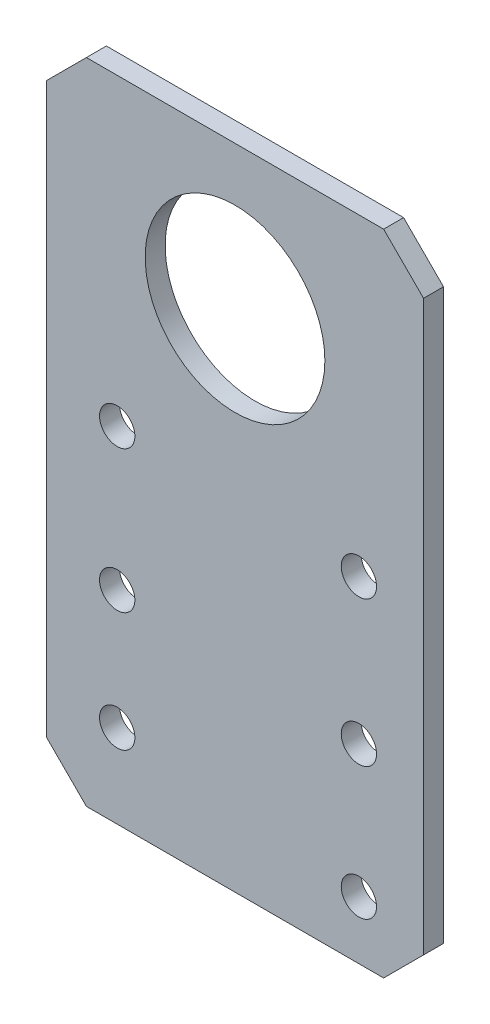
ISO-10303-21;
HEADER;
FILE_DESCRIPTION(('STEP AP214'),'2;1');
FILE_NAME('part.step','',(''),(''),'','','');
FILE_SCHEMA(('AUTOMOTIVE_DESIGN { 1 0 10303 214 1 1 1 1 }'));
ENDSEC;
DATA;
#1=APPLICATION_CONTEXT('core data for automotive mechanical design processes');
#2=APPLICATION_PROTOCOL_DEFINITION('international standard','automotive_design',2000,#1);
#3=PRODUCT_CONTEXT('',#1,'mechanical');
#4=PRODUCT('Part','Part','',(#3));
#5=PRODUCT_RELATED_PRODUCT_CATEGORY('part','',(#4));
#6=PRODUCT_DEFINITION_FORMATION('','',#4);
#7=PRODUCT_DEFINITION_CONTEXT('part definition',#1,'design');
#8=PRODUCT_DEFINITION('design','',#6,#7);
#9=PRODUCT_DEFINITION_SHAPE('','',#8);
#10=(LENGTH_UNIT() NAMED_UNIT(*) SI_UNIT(.MILLI.,.METRE.));
#11=(NAMED_UNIT(*) PLANE_ANGLE_UNIT() SI_UNIT($,.RADIAN.));
#12=(NAMED_UNIT(*) SI_UNIT($,.STERADIAN.) SOLID_ANGLE_UNIT());
#13=UNCERTAINTY_MEASURE_WITH_UNIT(LENGTH_MEASURE(1.E-05),#10,'distance_accuracy_value','');
#14=(GEOMETRIC_REPRESENTATION_CONTEXT(3) GLOBAL_UNCERTAINTY_ASSIGNED_CONTEXT((#13)) GLOBAL_UNIT_ASSIGNED_CONTEXT((#10,
#11,#12)) REPRESENTATION_CONTEXT('',''));
#15=CARTESIAN_POINT('',(0.,0.,0.));
#16=DIRECTION('',(0.,0.,1.));
#17=DIRECTION('',(1.,0.,0.));
#18=AXIS2_PLACEMENT_3D('',#15,#16,#17);
#19=CARTESIAN_POINT('',(0.,0.,3.175));
#20=DIRECTION('',(0.,0.,1.));
#21=DIRECTION('',(1.,0.,0.));
#22=AXIS2_PLACEMENT_3D('',#19,#20,#21);
#23=PLANE('',#22);
#24=CARTESIAN_POINT('',(275.136823716082,60.793377216612,3.175));
#25=DIRECTION('',(0.,0.,1.));
#26=DIRECTION('',(1.,0.,0.));
#27=AXIS2_PLACEMENT_3D('',#24,#25,#26);
#28=CIRCLE('',#27,2.8067);
#29=CARTESIAN_POINT('',(277.943523716082,60.793377216612,3.175));
#30=VERTEX_POINT('',#29);
#31=EDGE_CURVE('E202',#30,#30,#28,.F.);
#32=ORIENTED_EDGE('',*,*,#31,.T.);
#33=EDGE_LOOP('',(#32));
#34=FACE_BOUND('',#33,.T.);
#35=CARTESIAN_POINT('',(313.565840920205,58.8263999407559,3.175));
#36=DIRECTION('',(0.,0.,1.));
#37=DIRECTION('',(1.,0.,0.));
#38=AXIS2_PLACEMENT_3D('',#35,#36,#37);
#39=CIRCLE('',#38,2.8067);
#40=CARTESIAN_POINT('',(316.372540920205,58.8263999407559,3.175));
#41=VERTEX_POINT('',#40);
#42=EDGE_CURVE('E196',#41,#41,#39,.F.);
#43=ORIENTED_EDGE('',*,*,#42,.T.);
#44=EDGE_LOOP('',(#43));
#45=FACE_BOUND('',#44,.T.);
#46=CARTESIAN_POINT('',(313.565840920205,81.8855543431027,3.175));
#47=DIRECTION('',(0.,0.,1.));
#48=DIRECTION('',(1.,0.,0.));
#49=AXIS2_PLACEMENT_3D('',#46,#47,#48);
#50=CIRCLE('',#49,2.8067);
#51=CARTESIAN_POINT('',(316.372540920205,81.8855543431027,3.175));
#52=VERTEX_POINT('',#51);
#53=EDGE_CURVE('E190',#52,#52,#50,.F.);
#54=ORIENTED_EDGE('',*,*,#53,.T.);
#55=EDGE_LOOP('',(#54));
#56=FACE_BOUND('',#55,.T.);
#57=CARTESIAN_POINT('',(275.136823716082,41.8476468841504,3.175));
#58=DIRECTION('',(0.,0.,1.));
#59=DIRECTION('',(1.,0.,0.));
#60=AXIS2_PLACEMENT_3D('',#57,#58,#59);
#61=CIRCLE('',#60,2.8067);
#62=CARTESIAN_POINT('',(277.943523716082,41.8476468841504,3.175));
#63=VERTEX_POINT('',#62);
#64=EDGE_CURVE('E184',#63,#63,#61,.F.);
#65=ORIENTED_EDGE('',*,*,#64,.T.);
#66=EDGE_LOOP('',(#65));
#67=FACE_BOUND('',#66,.T.);
#68=DIRECTION('',(0.,-1.,0.));
#69=VECTOR('',#68,1.);
#70=CARTESIAN_POINT('',(263.889187586837,0.,3.175));
#71=LINE('',#70,#69);
#72=CARTESIAN_POINT('',(263.889187586837,125.321220391347,3.175));
#73=VERTEX_POINT('',#72);
#74=CARTESIAN_POINT('',(263.889187586837,34.8981609212184,3.175));
#75=VERTEX_POINT('',#74);
#76=EDGE_CURVE('E173',#73,#75,#71,.T.);
#77=ORIENTED_EDGE('',*,*,#76,.T.);
#78=DIRECTION('',(-0.707106781186548,0.707106781186547,0.));
#79=VECTOR('',#78,1.);
#80=CARTESIAN_POINT('',(149.393674254028,149.393674254028,3.175));
#81=LINE('',#80,#79);
#82=CARTESIAN_POINT('',(270.239187586837,28.5481609212184,3.175));
#83=VERTEX_POINT('',#82);
#84=EDGE_CURVE('E150',#75,#83,#81,.F.);
#85=ORIENTED_EDGE('',*,*,#84,.T.);
#86=DIRECTION('',(1.,0.,0.));
#87=VECTOR('',#86,1.);
#88=CARTESIAN_POINT('',(0.,28.5481609212184,3.175));
#89=LINE('',#88,#87);
#90=CARTESIAN_POINT('',(317.5,28.5481609212184,3.175));
#91=VERTEX_POINT('',#90);
#92=EDGE_CURVE('E120',#83,#91,#89,.T.);
#93=ORIENTED_EDGE('',*,*,#92,.T.);
#94=DIRECTION('',(0.70710678118655,0.707106781186545,0.));
#95=VECTOR('',#94,1.);
#96=CARTESIAN_POINT('',(144.47591953939,-144.475919539391,3.175));
#97=LINE('',#96,#95);
#98=CARTESIAN_POINT('',(323.85,34.8981609212184,3.175));
#99=VERTEX_POINT('',#98);
#100=EDGE_CURVE('E148',#91,#99,#97,.T.);
#101=ORIENTED_EDGE('',*,*,#100,.T.);
#102=DIRECTION('',(0.,-1.,0.));
#103=VECTOR('',#102,1.);
#104=CARTESIAN_POINT('',(323.85,0.,3.175));
#105=LINE('',#104,#103);
#106=CARTESIAN_POINT('',(323.85,125.321220391347,3.175));
#107=VERTEX_POINT('',#106);
#108=EDGE_CURVE('E131',#107,#99,#105,.T.);
#109=ORIENTED_EDGE('',*,*,#108,.F.);
#110=DIRECTION('',(0.707106781186549,-0.707106781186546,0.));
#111=VECTOR('',#110,1.);
#112=CARTESIAN_POINT('',(224.585610195673,224.585610195674,3.175));
#113=LINE('',#112,#111);
#114=CARTESIAN_POINT('',(317.5,131.671220391347,3.175));
#115=VERTEX_POINT('',#114);
#116=EDGE_CURVE('E49',#107,#115,#113,.F.);
#117=ORIENTED_EDGE('',*,*,#116,.T.);
#118=DIRECTION('',(1.,0.,0.));
#119=VECTOR('',#118,1.);
#120=CARTESIAN_POINT('',(0.,131.671220391347,3.175));
#121=LINE('',#120,#119);
#122=CARTESIAN_POINT('',(270.239187586837,131.671220391347,3.175));
#123=VERTEX_POINT('',#122);
#124=EDGE_CURVE('E176',#123,#115,#121,.T.);
#125=ORIENTED_EDGE('',*,*,#124,.F.);
#126=DIRECTION('',(-0.707106781186551,-0.707106781186544,0.));
#127=VECTOR('',#126,1.);
#128=CARTESIAN_POINT('',(69.283983597744,-69.2839835977447,3.175));
#129=LINE('',#128,#127);
#130=EDGE_CURVE('E145',#123,#73,#129,.T.);
#131=ORIENTED_EDGE('',*,*,#130,.T.);
#132=EDGE_LOOP('',(#77,#85,#93,#101,#109,#117,#125,#131));
#133=FACE_BOUND('',#132,.T.);
#134=CARTESIAN_POINT('',(293.869593793419,108.878190342355,3.175));
#135=DIRECTION('',(0.,0.,1.));
#136=DIRECTION('',(1.,0.,0.));
#137=AXIS2_PLACEMENT_3D('',#134,#135,#136);
#138=CIRCLE('',#137,14.2875);
#139=CARTESIAN_POINT('',(308.157093793419,108.878190342355,3.175));
#140=VERTEX_POINT('',#139);
#141=EDGE_CURVE('E127',#140,#140,#138,.T.);
#142=ORIENTED_EDGE('',*,*,#141,.F.);
#143=EDGE_LOOP('',(#142));
#144=FACE_BOUND('',#143,.T.);
#145=CARTESIAN_POINT('',(313.565840920205,37.7866756404615,3.175));
#146=DIRECTION('',(0.,0.,1.));
#147=DIRECTION('',(1.,0.,0.));
#148=AXIS2_PLACEMENT_3D('',#145,#146,#147);
#149=CIRCLE('',#148,2.8067);
#150=CARTESIAN_POINT('',(316.372540920205,37.7866756404615,3.175));
#151=VERTEX_POINT('',#150);
#152=EDGE_CURVE('E169',#151,#151,#149,.F.);
#153=ORIENTED_EDGE('',*,*,#152,.T.);
#154=EDGE_LOOP('',(#153));
#155=FACE_BOUND('',#154,.T.);
#156=CARTESIAN_POINT('',(275.136823716082,83.3634022478691,3.175));
#157=DIRECTION('',(0.,0.,1.));
#158=DIRECTION('',(1.,0.,0.));
#159=AXIS2_PLACEMENT_3D('',#156,#157,#158);
#160=CIRCLE('',#159,2.8067);
#161=CARTESIAN_POINT('',(277.943523716082,83.3634022478691,3.175));
#162=VERTEX_POINT('',#161);
#163=EDGE_CURVE('E208',#162,#162,#160,.F.);
#164=ORIENTED_EDGE('',*,*,#163,.T.);
#165=EDGE_LOOP('',(#164));
#166=FACE_BOUND('',#165,.T.);
#167=ADVANCED_FACE('F34',(#34,#45,#56,#67,#133,#144,#155,#166),#23,.T.);
#168=CARTESIAN_POINT('',(0.,0.,0.));
#169=DIRECTION('',(0.,0.,1.));
#170=DIRECTION('',(1.,0.,0.));
#171=AXIS2_PLACEMENT_3D('',#168,#169,#170);
#172=PLANE('',#171);
#173=CARTESIAN_POINT('',(275.136823716082,83.3634022478691,0.));
#174=DIRECTION('',(0.,0.,-1.));
#175=DIRECTION('',(-1.,0.,0.));
#176=AXIS2_PLACEMENT_3D('',#173,#174,#175);
#177=CIRCLE('',#176,2.8067);
#178=CARTESIAN_POINT('',(272.330123716082,83.3634022478691,0.));
#179=VERTEX_POINT('',#178);
#180=EDGE_CURVE('E211',#179,#179,#177,.T.);
#181=ORIENTED_EDGE('',*,*,#180,.F.);
#182=EDGE_LOOP('',(#181));
#183=FACE_BOUND('',#182,.T.);
#184=CARTESIAN_POINT('',(275.136823716082,60.793377216612,0.));
#185=DIRECTION('',(0.,0.,-1.));
#186=DIRECTION('',(-1.,0.,0.));
#187=AXIS2_PLACEMENT_3D('',#184,#185,#186);
#188=CIRCLE('',#187,2.8067);
#189=CARTESIAN_POINT('',(272.330123716082,60.793377216612,0.));
#190=VERTEX_POINT('',#189);
#191=EDGE_CURVE('E205',#190,#190,#188,.T.);
#192=ORIENTED_EDGE('',*,*,#191,.F.);
#193=EDGE_LOOP('',(#192));
#194=FACE_BOUND('',#193,.T.);
#195=CARTESIAN_POINT('',(313.565840920205,58.8263999407559,0.));
#196=DIRECTION('',(0.,0.,-1.));
#197=DIRECTION('',(-1.,0.,0.));
#198=AXIS2_PLACEMENT_3D('',#195,#196,#197);
#199=CIRCLE('',#198,2.8067);
#200=CARTESIAN_POINT('',(310.759140920205,58.8263999407559,0.));
#201=VERTEX_POINT('',#200);
#202=EDGE_CURVE('E199',#201,#201,#199,.T.);
#203=ORIENTED_EDGE('',*,*,#202,.F.);
#204=EDGE_LOOP('',(#203));
#205=FACE_BOUND('',#204,.T.);
#206=CARTESIAN_POINT('',(293.869593793419,108.878190342355,0.));
#207=DIRECTION('',(0.,0.,1.));
#208=DIRECTION('',(1.,0.,0.));
#209=AXIS2_PLACEMENT_3D('',#206,#207,#208);
#210=CIRCLE('',#209,14.2875);
#211=CARTESIAN_POINT('',(308.157093793419,108.878190342355,0.));
#212=VERTEX_POINT('',#211);
#213=EDGE_CURVE('E166',#212,#212,#210,.T.);
#214=ORIENTED_EDGE('',*,*,#213,.T.);
#215=EDGE_LOOP('',(#214));
#216=FACE_BOUND('',#215,.T.);
#217=DIRECTION('',(1.,0.,0.));
#218=VECTOR('',#217,1.);
#219=CARTESIAN_POINT('',(0.,28.5481609212184,0.));
#220=LINE('',#219,#218);
#221=CARTESIAN_POINT('',(270.239187586837,28.5481609212184,0.));
#222=VERTEX_POINT('',#221);
#223=CARTESIAN_POINT('',(317.5,28.5481609212184,0.));
#224=VERTEX_POINT('',#223);
#225=EDGE_CURVE('E117',#222,#224,#220,.T.);
#226=ORIENTED_EDGE('',*,*,#225,.F.);
#227=DIRECTION('',(0.707106781186548,-0.707106781186547,0.));
#228=VECTOR('',#227,1.);
#229=CARTESIAN_POINT('',(270.239187586837,28.5481609212184,0.));
#230=LINE('',#229,#228);
#231=CARTESIAN_POINT('',(263.889187586837,34.8981609212184,0.));
#232=VERTEX_POINT('',#231);
#233=EDGE_CURVE('E100',#222,#232,#230,.F.);
#234=ORIENTED_EDGE('',*,*,#233,.T.);
#235=DIRECTION('',(0.,-1.,0.));
#236=VECTOR('',#235,1.);
#237=CARTESIAN_POINT('',(263.889187586837,0.,0.));
#238=LINE('',#237,#236);
#239=CARTESIAN_POINT('',(263.889187586837,125.321220391347,0.));
#240=VERTEX_POINT('',#239);
#241=EDGE_CURVE('E128',#240,#232,#238,.T.);
#242=ORIENTED_EDGE('',*,*,#241,.F.);
#243=DIRECTION('',(0.707106781186551,0.707106781186544,0.));
#244=VECTOR('',#243,1.);
#245=CARTESIAN_POINT('',(263.889187586837,125.321220391347,0.));
#246=LINE('',#245,#244);
#247=CARTESIAN_POINT('',(270.239187586837,131.671220391347,0.));
#248=VERTEX_POINT('',#247);
#249=EDGE_CURVE('E121',#240,#248,#246,.T.);
#250=ORIENTED_EDGE('',*,*,#249,.T.);
#251=DIRECTION('',(1.,0.,0.));
#252=VECTOR('',#251,1.);
#253=CARTESIAN_POINT('',(0.,131.671220391347,0.));
#254=LINE('',#253,#252);
#255=CARTESIAN_POINT('',(317.5,131.671220391347,0.));
#256=VERTEX_POINT('',#255);
#257=EDGE_CURVE('E133',#248,#256,#254,.T.);
#258=ORIENTED_EDGE('',*,*,#257,.T.);
#259=DIRECTION('',(-0.707106781186549,0.707106781186546,0.));
#260=VECTOR('',#259,1.);
#261=CARTESIAN_POINT('',(317.5,131.671220391347,0.));
#262=LINE('',#261,#260);
#263=CARTESIAN_POINT('',(323.85,125.321220391347,0.));
#264=VERTEX_POINT('',#263);
#265=EDGE_CURVE('E139',#256,#264,#262,.F.);
#266=ORIENTED_EDGE('',*,*,#265,.T.);
#267=DIRECTION('',(0.,-1.,0.));
#268=VECTOR('',#267,1.);
#269=CARTESIAN_POINT('',(323.85,0.,0.));
#270=LINE('',#269,#268);
#271=CARTESIAN_POINT('',(323.85,34.8981609212184,0.));
#272=VERTEX_POINT('',#271);
#273=EDGE_CURVE('E161',#264,#272,#270,.T.);
#274=ORIENTED_EDGE('',*,*,#273,.T.);
#275=DIRECTION('',(-0.70710678118655,-0.707106781186545,0.));
#276=VECTOR('',#275,1.);
#277=CARTESIAN_POINT('',(323.85,34.8981609212184,0.));
#278=LINE('',#277,#276);
#279=EDGE_CURVE('E111',#272,#224,#278,.T.);
#280=ORIENTED_EDGE('',*,*,#279,.T.);
#281=EDGE_LOOP('',(#226,#234,#242,#250,#258,#266,#274,#280));
#282=FACE_BOUND('',#281,.T.);
#283=CARTESIAN_POINT('',(313.565840920205,37.7866756404615,0.));
#284=DIRECTION('',(0.,0.,-1.));
#285=DIRECTION('',(-1.,0.,0.));
#286=AXIS2_PLACEMENT_3D('',#283,#284,#285);
#287=CIRCLE('',#286,2.8067);
#288=CARTESIAN_POINT('',(310.759140920205,37.7866756404615,0.));
#289=VERTEX_POINT('',#288);
#290=EDGE_CURVE('E181',#289,#289,#287,.T.);
#291=ORIENTED_EDGE('',*,*,#290,.F.);
#292=EDGE_LOOP('',(#291));
#293=FACE_BOUND('',#292,.T.);
#294=CARTESIAN_POINT('',(275.136823716082,41.8476468841504,0.));
#295=DIRECTION('',(0.,0.,-1.));
#296=DIRECTION('',(-1.,0.,0.));
#297=AXIS2_PLACEMENT_3D('',#294,#295,#296);
#298=CIRCLE('',#297,2.8067);
#299=CARTESIAN_POINT('',(272.330123716082,41.8476468841504,0.));
#300=VERTEX_POINT('',#299);
#301=EDGE_CURVE('E187',#300,#300,#298,.T.);
#302=ORIENTED_EDGE('',*,*,#301,.F.);
#303=EDGE_LOOP('',(#302));
#304=FACE_BOUND('',#303,.T.);
#305=CARTESIAN_POINT('',(313.565840920205,81.8855543431027,0.));
#306=DIRECTION('',(0.,0.,-1.));
#307=DIRECTION('',(-1.,0.,0.));
#308=AXIS2_PLACEMENT_3D('',#305,#306,#307);
#309=CIRCLE('',#308,2.8067);
#310=CARTESIAN_POINT('',(310.759140920205,81.8855543431027,0.));
#311=VERTEX_POINT('',#310);
#312=EDGE_CURVE('E193',#311,#311,#309,.T.);
#313=ORIENTED_EDGE('',*,*,#312,.F.);
#314=EDGE_LOOP('',(#313));
#315=FACE_BOUND('',#314,.T.);
#316=ADVANCED_FACE('F124',(#183,#194,#205,#216,#282,#293,#304,#315),#172,.F.);
#317=CARTESIAN_POINT('',(323.85,0.,3.175));
#318=DIRECTION('',(1.,0.,0.));
#319=DIRECTION('',(0.,0.,-1.));
#320=AXIS2_PLACEMENT_3D('',#317,#318,#319);
#321=PLANE('',#320);
#322=ORIENTED_EDGE('',*,*,#108,.T.);
#323=DIRECTION('',(0.,0.,-1.));
#324=VECTOR('',#323,1.);
#325=CARTESIAN_POINT('',(323.85,34.8981609212184,0.));
#326=LINE('',#325,#324);
#327=EDGE_CURVE('E154',#99,#272,#326,.T.);
#328=ORIENTED_EDGE('',*,*,#327,.T.);
#329=ORIENTED_EDGE('',*,*,#273,.F.);
#330=DIRECTION('',(0.,0.,1.));
#331=VECTOR('',#330,1.);
#332=CARTESIAN_POINT('',(323.85,125.321220391347,3.175));
#333=LINE('',#332,#331);
#334=EDGE_CURVE('E152',#264,#107,#333,.T.);
#335=ORIENTED_EDGE('',*,*,#334,.T.);
#336=EDGE_LOOP('',(#322,#328,#329,#335));
#337=FACE_BOUND('',#336,.T.);
#338=ADVANCED_FACE('F160',(#337),#321,.T.);
#339=CARTESIAN_POINT('',(0.,131.671220391347,3.175));
#340=DIRECTION('',(0.,1.,0.));
#341=DIRECTION('',(0.,0.,1.));
#342=AXIS2_PLACEMENT_3D('',#339,#340,#341);
#343=PLANE('',#342);
#344=ORIENTED_EDGE('',*,*,#124,.T.);
#345=DIRECTION('',(0.,0.,-1.));
#346=VECTOR('',#345,1.);
#347=CARTESIAN_POINT('',(317.5,131.671220391347,3.175));
#348=LINE('',#347,#346);
#349=EDGE_CURVE('E11',#115,#256,#348,.T.);
#350=ORIENTED_EDGE('',*,*,#349,.T.);
#351=ORIENTED_EDGE('',*,*,#257,.F.);
#352=DIRECTION('',(0.,0.,1.));
#353=VECTOR('',#352,1.);
#354=CARTESIAN_POINT('',(270.239187586837,131.671220391347,3.175));
#355=LINE('',#354,#353);
#356=EDGE_CURVE('E42',#248,#123,#355,.T.);
#357=ORIENTED_EDGE('',*,*,#356,.T.);
#358=EDGE_LOOP('',(#344,#350,#351,#357));
#359=FACE_BOUND('',#358,.T.);
#360=ADVANCED_FACE('F236',(#359),#343,.T.);
#361=CARTESIAN_POINT('',(263.889187586837,0.,3.175));
#362=DIRECTION('',(1.,0.,0.));
#363=DIRECTION('',(0.,0.,-1.));
#364=AXIS2_PLACEMENT_3D('',#361,#362,#363);
#365=PLANE('',#364);
#366=ORIENTED_EDGE('',*,*,#241,.T.);
#367=DIRECTION('',(0.,0.,1.));
#368=VECTOR('',#367,1.);
#369=CARTESIAN_POINT('',(263.889187586837,34.8981609212184,3.175));
#370=LINE('',#369,#368);
#371=EDGE_CURVE('E105',#232,#75,#370,.T.);
#372=ORIENTED_EDGE('',*,*,#371,.T.);
#373=ORIENTED_EDGE('',*,*,#76,.F.);
#374=DIRECTION('',(0.,0.,-1.));
#375=VECTOR('',#374,1.);
#376=CARTESIAN_POINT('',(263.889187586837,125.321220391347,0.));
#377=LINE('',#376,#375);
#378=EDGE_CURVE('E110',#73,#240,#377,.T.);
#379=ORIENTED_EDGE('',*,*,#378,.T.);
#380=EDGE_LOOP('',(#366,#372,#373,#379));
#381=FACE_BOUND('',#380,.T.);
#382=ADVANCED_FACE('F228',(#381),#365,.F.);
#383=CARTESIAN_POINT('',(293.869593793419,108.878190342355,3.175));
#384=DIRECTION('',(0.,0.,-1.));
#385=DIRECTION('',(-1.,0.,0.));
#386=AXIS2_PLACEMENT_3D('',#383,#384,#385);
#387=CYLINDRICAL_SURFACE('',#386,14.2875);
#388=ORIENTED_EDGE('',*,*,#141,.T.);
#389=EDGE_LOOP('',(#388));
#390=FACE_BOUND('',#389,.T.);
#391=ORIENTED_EDGE('',*,*,#213,.F.);
#392=EDGE_LOOP('',(#391));
#393=FACE_BOUND('',#392,.T.);
#394=ADVANCED_FACE('F226',(#390,#393),#387,.F.);
#395=CARTESIAN_POINT('',(0.,28.5481609212184,3.175));
#396=DIRECTION('',(0.,1.,0.));
#397=DIRECTION('',(0.,0.,1.));
#398=AXIS2_PLACEMENT_3D('',#395,#396,#397);
#399=PLANE('',#398);
#400=ORIENTED_EDGE('',*,*,#92,.F.);
#401=DIRECTION('',(0.,0.,-1.));
#402=VECTOR('',#401,1.);
#403=CARTESIAN_POINT('',(270.239187586837,28.5481609212184,3.175));
#404=LINE('',#403,#402);
#405=EDGE_CURVE('E104',#83,#222,#404,.T.);
#406=ORIENTED_EDGE('',*,*,#405,.T.);
#407=ORIENTED_EDGE('',*,*,#225,.T.);
#408=DIRECTION('',(0.,0.,1.));
#409=VECTOR('',#408,1.);
#410=CARTESIAN_POINT('',(317.5,28.5481609212184,3.175));
#411=LINE('',#410,#409);
#412=EDGE_CURVE('E122',#224,#91,#411,.T.);
#413=ORIENTED_EDGE('',*,*,#412,.T.);
#414=EDGE_LOOP('',(#400,#406,#407,#413));
#415=FACE_BOUND('',#414,.T.);
#416=ADVANCED_FACE('F116',(#415),#399,.F.);
#417=CARTESIAN_POINT('',(270.239187586837,28.5481609212184,3.175));
#418=DIRECTION('',(0.707106781186547,0.707106781186548,0.));
#419=DIRECTION('',(0.,0.,-1.));
#420=AXIS2_PLACEMENT_3D('',#417,#418,#419);
#421=PLANE('',#420);
#422=ORIENTED_EDGE('',*,*,#84,.F.);
#423=ORIENTED_EDGE('',*,*,#371,.F.);
#424=ORIENTED_EDGE('',*,*,#233,.F.);
#425=ORIENTED_EDGE('',*,*,#405,.F.);
#426=EDGE_LOOP('',(#422,#423,#424,#425));
#427=FACE_BOUND('',#426,.T.);
#428=ADVANCED_FACE('F103',(#427),#421,.F.);
#429=CARTESIAN_POINT('',(323.85,34.8981609212184,3.175));
#430=DIRECTION('',(0.707106781186545,-0.70710678118655,0.));
#431=DIRECTION('',(0.,0.,1.));
#432=AXIS2_PLACEMENT_3D('',#429,#430,#431);
#433=PLANE('',#432);
#434=ORIENTED_EDGE('',*,*,#100,.F.);
#435=ORIENTED_EDGE('',*,*,#412,.F.);
#436=ORIENTED_EDGE('',*,*,#279,.F.);
#437=ORIENTED_EDGE('',*,*,#327,.F.);
#438=EDGE_LOOP('',(#434,#435,#436,#437));
#439=FACE_BOUND('',#438,.T.);
#440=ADVANCED_FACE('F281',(#439),#433,.T.);
#441=CARTESIAN_POINT('',(317.5,131.671220391347,3.175));
#442=DIRECTION('',(-0.707106781186546,-0.707106781186549,0.));
#443=DIRECTION('',(0.,0.,-1.));
#444=AXIS2_PLACEMENT_3D('',#441,#442,#443);
#445=PLANE('',#444);
#446=ORIENTED_EDGE('',*,*,#116,.F.);
#447=ORIENTED_EDGE('',*,*,#334,.F.);
#448=ORIENTED_EDGE('',*,*,#265,.F.);
#449=ORIENTED_EDGE('',*,*,#349,.F.);
#450=EDGE_LOOP('',(#446,#447,#448,#449));
#451=FACE_BOUND('',#450,.T.);
#452=ADVANCED_FACE('F289',(#451),#445,.F.);
#453=CARTESIAN_POINT('',(263.889187586837,125.321220391347,3.175));
#454=DIRECTION('',(-0.707106781186544,0.707106781186551,0.));
#455=DIRECTION('',(0.,0.,1.));
#456=AXIS2_PLACEMENT_3D('',#453,#454,#455);
#457=PLANE('',#456);
#458=ORIENTED_EDGE('',*,*,#130,.F.);
#459=ORIENTED_EDGE('',*,*,#356,.F.);
#460=ORIENTED_EDGE('',*,*,#249,.F.);
#461=ORIENTED_EDGE('',*,*,#378,.F.);
#462=EDGE_LOOP('',(#458,#459,#460,#461));
#463=FACE_BOUND('',#462,.T.);
#464=ADVANCED_FACE('F36',(#463),#457,.T.);
#465=CARTESIAN_POINT('',(313.565840920205,37.7866756404615,0.));
#466=DIRECTION('',(0.,0.,-1.));
#467=DIRECTION('',(-1.,0.,0.));
#468=AXIS2_PLACEMENT_3D('',#465,#466,#467);
#469=CYLINDRICAL_SURFACE('',#468,2.8067);
#470=ORIENTED_EDGE('',*,*,#152,.F.);
#471=EDGE_LOOP('',(#470));
#472=FACE_BOUND('',#471,.T.);
#473=ORIENTED_EDGE('',*,*,#290,.T.);
#474=EDGE_LOOP('',(#473));
#475=FACE_BOUND('',#474,.T.);
#476=ADVANCED_FACE('F248',(#472,#475),#469,.F.);
#477=CARTESIAN_POINT('',(275.136823716082,41.8476468841504,0.));
#478=DIRECTION('',(0.,0.,-1.));
#479=DIRECTION('',(-1.,0.,0.));
#480=AXIS2_PLACEMENT_3D('',#477,#478,#479);
#481=CYLINDRICAL_SURFACE('',#480,2.8067);
#482=ORIENTED_EDGE('',*,*,#64,.F.);
#483=EDGE_LOOP('',(#482));
#484=FACE_BOUND('',#483,.T.);
#485=ORIENTED_EDGE('',*,*,#301,.T.);
#486=EDGE_LOOP('',(#485));
#487=FACE_BOUND('',#486,.T.);
#488=ADVANCED_FACE('F324',(#484,#487),#481,.F.);
#489=CARTESIAN_POINT('',(313.565840920205,81.8855543431027,0.));
#490=DIRECTION('',(0.,0.,-1.));
#491=DIRECTION('',(-1.,0.,0.));
#492=AXIS2_PLACEMENT_3D('',#489,#490,#491);
#493=CYLINDRICAL_SURFACE('',#492,2.8067);
#494=ORIENTED_EDGE('',*,*,#53,.F.);
#495=EDGE_LOOP('',(#494));
#496=FACE_BOUND('',#495,.T.);
#497=ORIENTED_EDGE('',*,*,#312,.T.);
#498=EDGE_LOOP('',(#497));
#499=FACE_BOUND('',#498,.T.);
#500=ADVANCED_FACE('F333',(#496,#499),#493,.F.);
#501=CARTESIAN_POINT('',(313.565840920205,58.8263999407559,0.));
#502=DIRECTION('',(0.,0.,-1.));
#503=DIRECTION('',(-1.,0.,0.));
#504=AXIS2_PLACEMENT_3D('',#501,#502,#503);
#505=CYLINDRICAL_SURFACE('',#504,2.8067);
#506=ORIENTED_EDGE('',*,*,#42,.F.);
#507=EDGE_LOOP('',(#506));
#508=FACE_BOUND('',#507,.T.);
#509=ORIENTED_EDGE('',*,*,#202,.T.);
#510=EDGE_LOOP('',(#509));
#511=FACE_BOUND('',#510,.T.);
#512=ADVANCED_FACE('F342',(#508,#511),#505,.F.);
#513=CARTESIAN_POINT('',(275.136823716082,60.793377216612,0.));
#514=DIRECTION('',(0.,0.,-1.));
#515=DIRECTION('',(-1.,0.,0.));
#516=AXIS2_PLACEMENT_3D('',#513,#514,#515);
#517=CYLINDRICAL_SURFACE('',#516,2.8067);
#518=ORIENTED_EDGE('',*,*,#31,.F.);
#519=EDGE_LOOP('',(#518));
#520=FACE_BOUND('',#519,.T.);
#521=ORIENTED_EDGE('',*,*,#191,.T.);
#522=EDGE_LOOP('',(#521));
#523=FACE_BOUND('',#522,.T.);
#524=ADVANCED_FACE('F352',(#520,#523),#517,.F.);
#525=CARTESIAN_POINT('',(275.136823716082,83.3634022478691,0.));
#526=DIRECTION('',(0.,0.,-1.));
#527=DIRECTION('',(-1.,0.,0.));
#528=AXIS2_PLACEMENT_3D('',#525,#526,#527);
#529=CYLINDRICAL_SURFACE('',#528,2.8067);
#530=ORIENTED_EDGE('',*,*,#163,.F.);
#531=EDGE_LOOP('',(#530));
#532=FACE_BOUND('',#531,.T.);
#533=ORIENTED_EDGE('',*,*,#180,.T.);
#534=EDGE_LOOP('',(#533));
#535=FACE_BOUND('',#534,.T.);
#536=ADVANCED_FACE('F215',(#532,#535),#529,.F.);
#537=CLOSED_SHELL('',(#167,#316,#338,#360,#382,#394,#416,#428,#440,#452,#464,#476,#488,#500,
#512,#524,#536));
#538=MANIFOLD_SOLID_BREP('B2',#537);
#539=ADVANCED_BREP_SHAPE_REPRESENTATION('',(#18,#538),#14);
#540=SHAPE_DEFINITION_REPRESENTATION(#9,#539);
ENDSEC;
END-ISO-10303-21;
